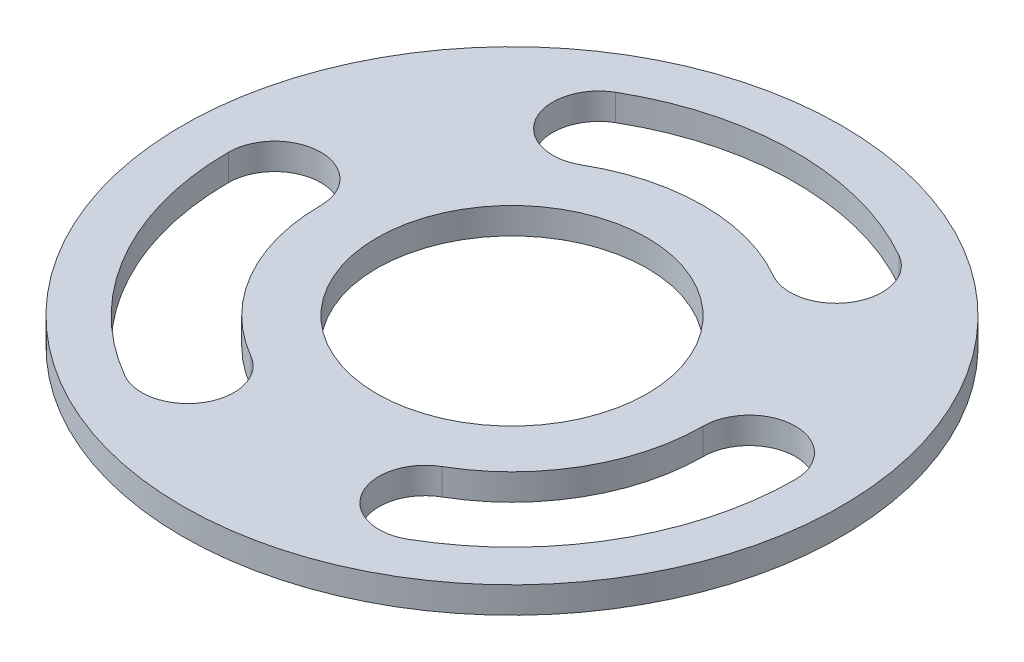
ISO-10303-21;
HEADER;
FILE_DESCRIPTION(('STEP AP214'),'2;1');
FILE_NAME('part.step','',(''),(''),'','','');
FILE_SCHEMA(('AUTOMOTIVE_DESIGN { 1 0 10303 214 1 1 1 1 }'));
ENDSEC;
DATA;
#1=APPLICATION_CONTEXT('core data for automotive mechanical design processes');
#2=APPLICATION_PROTOCOL_DEFINITION('international standard','automotive_design',2000,#1);
#3=PRODUCT_CONTEXT('',#1,'mechanical');
#4=PRODUCT('Part','Part','',(#3));
#5=PRODUCT_RELATED_PRODUCT_CATEGORY('part','',(#4));
#6=PRODUCT_DEFINITION_FORMATION('','',#4);
#7=PRODUCT_DEFINITION_CONTEXT('part definition',#1,'design');
#8=PRODUCT_DEFINITION('design','',#6,#7);
#9=PRODUCT_DEFINITION_SHAPE('','',#8);
#10=(LENGTH_UNIT() NAMED_UNIT(*) SI_UNIT(.MILLI.,.METRE.));
#11=(NAMED_UNIT(*) PLANE_ANGLE_UNIT() SI_UNIT($,.RADIAN.));
#12=(NAMED_UNIT(*) SI_UNIT($,.STERADIAN.) SOLID_ANGLE_UNIT());
#13=UNCERTAINTY_MEASURE_WITH_UNIT(LENGTH_MEASURE(1.E-05),#10,'distance_accuracy_value','');
#14=(GEOMETRIC_REPRESENTATION_CONTEXT(3) GLOBAL_UNCERTAINTY_ASSIGNED_CONTEXT((#13)) GLOBAL_UNIT_ASSIGNED_CONTEXT((#10,
#11,#12)) REPRESENTATION_CONTEXT('',''));
#15=CARTESIAN_POINT('',(0.,0.,0.));
#16=DIRECTION('',(0.,0.,1.));
#17=DIRECTION('',(1.,0.,0.));
#18=AXIS2_PLACEMENT_3D('',#15,#16,#17);
#19=CARTESIAN_POINT('',(0.,1.,0.));
#20=DIRECTION('',(0.,1.,0.));
#21=DIRECTION('',(0.,0.,1.));
#22=AXIS2_PLACEMENT_3D('',#19,#20,#21);
#23=PLANE('',#22);
#24=CARTESIAN_POINT('',(0.,1.,0.));
#25=DIRECTION('',(0.,1.,0.));
#26=DIRECTION('',(0.,0.,1.));
#27=AXIS2_PLACEMENT_3D('',#24,#25,#26);
#28=CIRCLE('',#27,10.7499999999999);
#29=CARTESIAN_POINT('',(5.37500000000003,1.,9.30977309068263));
#30=VERTEX_POINT('',#29);
#31=CARTESIAN_POINT('',(10.7499999999999,1.,-2.48267632254224E-13));
#32=VERTEX_POINT('',#31);
#33=EDGE_CURVE('E159',#30,#32,#28,.T.);
#34=ORIENTED_EDGE('',*,*,#33,.F.);
#35=CARTESIAN_POINT('',(4.49999999999993,1.,7.79422863405971));
#36=DIRECTION('',(0.,1.,0.));
#37=DIRECTION('',(0.,0.,1.));
#38=AXIS2_PLACEMENT_3D('',#35,#36,#37);
#39=CIRCLE('',#38,1.74999999999999);
#40=CARTESIAN_POINT('',(3.62500000000003,1.,6.27868417743714));
#41=VERTEX_POINT('',#40);
#42=EDGE_CURVE('E157',#41,#30,#39,.T.);
#43=ORIENTED_EDGE('',*,*,#42,.F.);
#44=CARTESIAN_POINT('',(0.,1.,0.));
#45=DIRECTION('',(0.,-1.,0.));
#46=DIRECTION('',(0.,0.,1.));
#47=AXIS2_PLACEMENT_3D('',#44,#45,#46);
#48=CIRCLE('',#47,7.24999999999995);
#49=CARTESIAN_POINT('',(7.24999999999995,1.,-1.66927781864533E-13));
#50=VERTEX_POINT('',#49);
#51=EDGE_CURVE('E165',#50,#41,#48,.T.);
#52=ORIENTED_EDGE('',*,*,#51,.F.);
#53=CARTESIAN_POINT('',(8.9999999999999,1.,-2.07018430176111E-13));
#54=DIRECTION('',(0.,1.,0.));
#55=DIRECTION('',(0.,0.,1.));
#56=AXIS2_PLACEMENT_3D('',#53,#54,#55);
#57=CIRCLE('',#56,1.74999999999996);
#58=EDGE_CURVE('E162',#32,#50,#57,.T.);
#59=ORIENTED_EDGE('',*,*,#58,.F.);
#60=EDGE_LOOP('',(#34,#43,#52,#59));
#61=FACE_BOUND('',#60,.T.);
#62=CARTESIAN_POINT('',(0.,1.,0.));
#63=DIRECTION('',(0.,1.,0.));
#64=DIRECTION('',(0.,0.,1.));
#65=AXIS2_PLACEMENT_3D('',#62,#63,#64);
#66=CIRCLE('',#65,5.125);
#67=CARTESIAN_POINT('',(0.,1.,5.125));
#68=VERTEX_POINT('',#67);
#69=EDGE_CURVE('E219',#68,#68,#66,.T.);
#70=ORIENTED_EDGE('',*,*,#69,.F.);
#71=EDGE_LOOP('',(#70));
#72=FACE_BOUND('',#71,.T.);
#73=CARTESIAN_POINT('',(0.,1.,0.));
#74=DIRECTION('',(0.,1.,0.));
#75=DIRECTION('',(0.,0.,1.));
#76=AXIS2_PLACEMENT_3D('',#73,#74,#75);
#77=CIRCLE('',#76,12.5);
#78=CARTESIAN_POINT('',(0.,1.,12.5));
#79=VERTEX_POINT('',#78);
#80=EDGE_CURVE('E11',#79,#79,#77,.T.);
#81=ORIENTED_EDGE('',*,*,#80,.T.);
#82=EDGE_LOOP('',(#81));
#83=FACE_BOUND('',#82,.T.);
#84=CARTESIAN_POINT('',(0.,1.,0.));
#85=DIRECTION('',(0.,1.,0.));
#86=DIRECTION('',(0.,0.,1.));
#87=AXIS2_PLACEMENT_3D('',#84,#85,#86);
#88=CIRCLE('',#87,10.75);
#89=CARTESIAN_POINT('',(5.37499999999975,1.,-9.30977309068281));
#90=VERTEX_POINT('',#89);
#91=CARTESIAN_POINT('',(-5.37499999999992,1.,-9.30977309068272));
#92=VERTEX_POINT('',#91);
#93=EDGE_CURVE('E190',#90,#92,#88,.T.);
#94=ORIENTED_EDGE('',*,*,#93,.F.);
#95=CARTESIAN_POINT('',(4.49999999999988,1.,-7.79422863406019));
#96=DIRECTION('',(0.,1.,0.));
#97=DIRECTION('',(0.,0.,1.));
#98=AXIS2_PLACEMENT_3D('',#95,#96,#97);
#99=CIRCLE('',#98,1.74999999999987);
#100=CARTESIAN_POINT('',(3.62499999999996,1.,-6.27868417743747));
#101=VERTEX_POINT('',#100);
#102=EDGE_CURVE('E188',#101,#90,#99,.T.);
#103=ORIENTED_EDGE('',*,*,#102,.F.);
#104=CARTESIAN_POINT('',(0.,1.,0.));
#105=DIRECTION('',(0.,-1.,0.));
#106=DIRECTION('',(0.,0.,1.));
#107=AXIS2_PLACEMENT_3D('',#104,#105,#106);
#108=CIRCLE('',#107,7.25000000000027);
#109=CARTESIAN_POINT('',(-3.62500000000008,1.,-6.27868417743741));
#110=VERTEX_POINT('',#109);
#111=EDGE_CURVE('E196',#110,#101,#108,.T.);
#112=ORIENTED_EDGE('',*,*,#111,.F.);
#113=CARTESIAN_POINT('',(-4.50000000000008,1.,-7.79422863406019));
#114=DIRECTION('',(0.,1.,0.));
#115=DIRECTION('',(0.,0.,1.));
#116=AXIS2_PLACEMENT_3D('',#113,#114,#115);
#117=CIRCLE('',#116,1.74999999999985);
#118=EDGE_CURVE('E193',#92,#110,#117,.T.);
#119=ORIENTED_EDGE('',*,*,#118,.F.);
#120=EDGE_LOOP('',(#94,#103,#112,#119));
#121=FACE_BOUND('',#120,.T.);
#122=CARTESIAN_POINT('',(0.,1.,0.));
#123=DIRECTION('',(0.,1.,0.));
#124=DIRECTION('',(0.,0.,1.));
#125=AXIS2_PLACEMENT_3D('',#122,#123,#124);
#126=CIRCLE('',#125,10.7499999999998);
#127=CARTESIAN_POINT('',(-10.7499999999998,1.,-2.48513643369444E-13));
#128=VERTEX_POINT('',#127);
#129=CARTESIAN_POINT('',(-5.37500000000015,1.,9.30977309068245));
#130=VERTEX_POINT('',#129);
#131=EDGE_CURVE('E129',#128,#130,#126,.T.);
#132=ORIENTED_EDGE('',*,*,#131,.F.);
#133=CARTESIAN_POINT('',(-9.00000000000009,1.,-2.03531578020356E-13));
#134=DIRECTION('',(0.,1.,0.));
#135=DIRECTION('',(0.,0.,1.));
#136=AXIS2_PLACEMENT_3D('',#133,#134,#135);
#137=CIRCLE('',#136,1.74999999999989);
#138=CARTESIAN_POINT('',(-7.24999999999998,1.,-1.67490556817035E-13));
#139=VERTEX_POINT('',#138);
#140=EDGE_CURVE('E121',#139,#128,#137,.T.);
#141=ORIENTED_EDGE('',*,*,#140,.F.);
#142=CARTESIAN_POINT('',(0.,1.,0.));
#143=DIRECTION('',(0.,-1.,0.));
#144=DIRECTION('',(0.,0.,1.));
#145=AXIS2_PLACEMENT_3D('',#142,#143,#144);
#146=CIRCLE('',#145,7.24999999999998);
#147=CARTESIAN_POINT('',(-3.62500000000015,1.,6.2786841774371));
#148=VERTEX_POINT('',#147);
#149=EDGE_CURVE('E143',#148,#139,#146,.T.);
#150=ORIENTED_EDGE('',*,*,#149,.F.);
#151=CARTESIAN_POINT('',(-4.50000000000011,1.,7.79422863405971));
#152=DIRECTION('',(0.,1.,0.));
#153=DIRECTION('',(0.,0.,1.));
#154=AXIS2_PLACEMENT_3D('',#151,#152,#153);
#155=CIRCLE('',#154,1.74999999999994);
#156=EDGE_CURVE('E141',#130,#148,#155,.T.);
#157=ORIENTED_EDGE('',*,*,#156,.F.);
#158=EDGE_LOOP('',(#132,#141,#150,#157));
#159=FACE_BOUND('',#158,.T.);
#160=ADVANCED_FACE('F32',(#61,#72,#83,#121,#159),#23,.T.);
#161=CARTESIAN_POINT('',(0.,0.,0.));
#162=DIRECTION('',(0.,1.,0.));
#163=DIRECTION('',(0.,0.,1.));
#164=AXIS2_PLACEMENT_3D('',#161,#162,#163);
#165=PLANE('',#164);
#166=CARTESIAN_POINT('',(4.49999999999993,0.,7.79422863405971));
#167=DIRECTION('',(0.,1.,0.));
#168=DIRECTION('',(0.,0.,1.));
#169=AXIS2_PLACEMENT_3D('',#166,#167,#168);
#170=CIRCLE('',#169,1.74999999999999);
#171=CARTESIAN_POINT('',(3.62500000000003,0.,6.27868417743714));
#172=VERTEX_POINT('',#171);
#173=CARTESIAN_POINT('',(5.37500000000003,0.,9.30977309068263));
#174=VERTEX_POINT('',#173);
#175=EDGE_CURVE('E137',#172,#174,#170,.T.);
#176=ORIENTED_EDGE('',*,*,#175,.T.);
#177=CARTESIAN_POINT('',(0.,0.,0.));
#178=DIRECTION('',(0.,1.,0.));
#179=DIRECTION('',(0.,0.,1.));
#180=AXIS2_PLACEMENT_3D('',#177,#178,#179);
#181=CIRCLE('',#180,10.7499999999999);
#182=CARTESIAN_POINT('',(10.7499999999999,0.,-2.48267632254224E-13));
#183=VERTEX_POINT('',#182);
#184=EDGE_CURVE('E170',#174,#183,#181,.T.);
#185=ORIENTED_EDGE('',*,*,#184,.T.);
#186=CARTESIAN_POINT('',(8.9999999999999,0.,-2.07018430176111E-13));
#187=DIRECTION('',(0.,1.,0.));
#188=DIRECTION('',(0.,0.,1.));
#189=AXIS2_PLACEMENT_3D('',#186,#187,#188);
#190=CIRCLE('',#189,1.74999999999996);
#191=CARTESIAN_POINT('',(7.24999999999994,0.,-1.66927781864532E-13));
#192=VERTEX_POINT('',#191);
#193=EDGE_CURVE('E173',#183,#192,#190,.T.);
#194=ORIENTED_EDGE('',*,*,#193,.T.);
#195=CARTESIAN_POINT('',(0.,0.,0.));
#196=DIRECTION('',(0.,-1.,0.));
#197=DIRECTION('',(0.,0.,1.));
#198=AXIS2_PLACEMENT_3D('',#195,#196,#197);
#199=CIRCLE('',#198,7.24999999999995);
#200=EDGE_CURVE('E160',#192,#172,#199,.T.);
#201=ORIENTED_EDGE('',*,*,#200,.T.);
#202=EDGE_LOOP('',(#176,#185,#194,#201));
#203=FACE_BOUND('',#202,.T.);
#204=CARTESIAN_POINT('',(0.,0.,0.));
#205=DIRECTION('',(0.,1.,0.));
#206=DIRECTION('',(0.,0.,1.));
#207=AXIS2_PLACEMENT_3D('',#204,#205,#206);
#208=CIRCLE('',#207,5.125);
#209=CARTESIAN_POINT('',(0.,0.,5.125));
#210=VERTEX_POINT('',#209);
#211=EDGE_CURVE('E218',#210,#210,#208,.T.);
#212=ORIENTED_EDGE('',*,*,#211,.T.);
#213=EDGE_LOOP('',(#212));
#214=FACE_BOUND('',#213,.T.);
#215=CARTESIAN_POINT('',(0.,0.,0.));
#216=DIRECTION('',(0.,1.,0.));
#217=DIRECTION('',(0.,0.,1.));
#218=AXIS2_PLACEMENT_3D('',#215,#216,#217);
#219=CIRCLE('',#218,12.5);
#220=CARTESIAN_POINT('',(0.,0.,12.5));
#221=VERTEX_POINT('',#220);
#222=EDGE_CURVE('E36',#221,#221,#219,.T.);
#223=ORIENTED_EDGE('',*,*,#222,.F.);
#224=EDGE_LOOP('',(#223));
#225=FACE_BOUND('',#224,.T.);
#226=CARTESIAN_POINT('',(4.49999999999988,0.,-7.79422863406019));
#227=DIRECTION('',(0.,1.,0.));
#228=DIRECTION('',(0.,0.,1.));
#229=AXIS2_PLACEMENT_3D('',#226,#227,#228);
#230=CIRCLE('',#229,1.74999999999987);
#231=CARTESIAN_POINT('',(3.62499999999996,0.,-6.27868417743747));
#232=VERTEX_POINT('',#231);
#233=CARTESIAN_POINT('',(5.37499999999975,0.,-9.30977309068281));
#234=VERTEX_POINT('',#233);
#235=EDGE_CURVE('E187',#232,#234,#230,.T.);
#236=ORIENTED_EDGE('',*,*,#235,.T.);
#237=CARTESIAN_POINT('',(0.,0.,0.));
#238=DIRECTION('',(0.,1.,0.));
#239=DIRECTION('',(0.,0.,1.));
#240=AXIS2_PLACEMENT_3D('',#237,#238,#239);
#241=CIRCLE('',#240,10.75);
#242=CARTESIAN_POINT('',(-5.37499999999992,0.,-9.30977309068272));
#243=VERTEX_POINT('',#242);
#244=EDGE_CURVE('E201',#234,#243,#241,.T.);
#245=ORIENTED_EDGE('',*,*,#244,.T.);
#246=CARTESIAN_POINT('',(-4.50000000000008,0.,-7.79422863406019));
#247=DIRECTION('',(0.,1.,0.));
#248=DIRECTION('',(0.,0.,1.));
#249=AXIS2_PLACEMENT_3D('',#246,#247,#248);
#250=CIRCLE('',#249,1.74999999999985);
#251=CARTESIAN_POINT('',(-3.62500000000016,0.,-6.27868417743754));
#252=VERTEX_POINT('',#251);
#253=EDGE_CURVE('E204',#243,#252,#250,.T.);
#254=ORIENTED_EDGE('',*,*,#253,.T.);
#255=CARTESIAN_POINT('',(0.,0.,0.));
#256=DIRECTION('',(0.,-1.,0.));
#257=DIRECTION('',(0.,0.,1.));
#258=AXIS2_PLACEMENT_3D('',#255,#256,#257);
#259=CIRCLE('',#258,7.25000000000027);
#260=EDGE_CURVE('E191',#252,#232,#259,.T.);
#261=ORIENTED_EDGE('',*,*,#260,.T.);
#262=EDGE_LOOP('',(#236,#245,#254,#261));
#263=FACE_BOUND('',#262,.T.);
#264=CARTESIAN_POINT('',(-9.00000000000009,0.,-2.03531578020356E-13));
#265=DIRECTION('',(0.,1.,0.));
#266=DIRECTION('',(0.,0.,1.));
#267=AXIS2_PLACEMENT_3D('',#264,#265,#266);
#268=CIRCLE('',#267,1.74999999999989);
#269=CARTESIAN_POINT('',(-7.24999999999998,0.,-1.67490556817035E-13));
#270=VERTEX_POINT('',#269);
#271=CARTESIAN_POINT('',(-10.7499999999998,0.,-2.48513643369444E-13));
#272=VERTEX_POINT('',#271);
#273=EDGE_CURVE('E55',#270,#272,#268,.T.);
#274=ORIENTED_EDGE('',*,*,#273,.T.);
#275=CARTESIAN_POINT('',(0.,0.,0.));
#276=DIRECTION('',(0.,1.,0.));
#277=DIRECTION('',(0.,0.,1.));
#278=AXIS2_PLACEMENT_3D('',#275,#276,#277);
#279=CIRCLE('',#278,10.7499999999998);
#280=CARTESIAN_POINT('',(-5.37500000000015,0.,9.30977309068245));
#281=VERTEX_POINT('',#280);
#282=EDGE_CURVE('E136',#272,#281,#279,.T.);
#283=ORIENTED_EDGE('',*,*,#282,.T.);
#284=CARTESIAN_POINT('',(-4.50000000000011,0.,7.79422863405971));
#285=DIRECTION('',(0.,1.,0.));
#286=DIRECTION('',(0.,0.,1.));
#287=AXIS2_PLACEMENT_3D('',#284,#285,#286);
#288=CIRCLE('',#287,1.74999999999994);
#289=CARTESIAN_POINT('',(-3.6250000000001,0.,6.27868417743702));
#290=VERTEX_POINT('',#289);
#291=EDGE_CURVE('E149',#281,#290,#288,.T.);
#292=ORIENTED_EDGE('',*,*,#291,.T.);
#293=CARTESIAN_POINT('',(0.,0.,0.));
#294=DIRECTION('',(0.,-1.,0.));
#295=DIRECTION('',(0.,0.,1.));
#296=AXIS2_PLACEMENT_3D('',#293,#294,#295);
#297=CIRCLE('',#296,7.24999999999998);
#298=EDGE_CURVE('E130',#290,#270,#297,.T.);
#299=ORIENTED_EDGE('',*,*,#298,.T.);
#300=EDGE_LOOP('',(#274,#283,#292,#299));
#301=FACE_BOUND('',#300,.T.);
#302=ADVANCED_FACE('F225',(#203,#214,#225,#263,#301),#165,.F.);
#303=CARTESIAN_POINT('',(0.,1.,0.));
#304=DIRECTION('',(0.,-1.,0.));
#305=DIRECTION('',(0.,0.,-1.));
#306=AXIS2_PLACEMENT_3D('',#303,#304,#305);
#307=CYLINDRICAL_SURFACE('',#306,12.5);
#308=ORIENTED_EDGE('',*,*,#80,.F.);
#309=EDGE_LOOP('',(#308));
#310=FACE_BOUND('',#309,.T.);
#311=ORIENTED_EDGE('',*,*,#222,.T.);
#312=EDGE_LOOP('',(#311));
#313=FACE_BOUND('',#312,.T.);
#314=ADVANCED_FACE('F34',(#310,#313),#307,.T.);
#315=CARTESIAN_POINT('',(0.,1.,0.));
#316=DIRECTION('',(0.,-1.,0.));
#317=DIRECTION('',(0.,0.,-1.));
#318=AXIS2_PLACEMENT_3D('',#315,#316,#317);
#319=CYLINDRICAL_SURFACE('',#318,5.125);
#320=ORIENTED_EDGE('',*,*,#69,.T.);
#321=EDGE_LOOP('',(#320));
#322=FACE_BOUND('',#321,.T.);
#323=ORIENTED_EDGE('',*,*,#211,.F.);
#324=EDGE_LOOP('',(#323));
#325=FACE_BOUND('',#324,.T.);
#326=ADVANCED_FACE('F228',(#322,#325),#319,.F.);
#327=CARTESIAN_POINT('',(4.49999999999988,1.,-7.79422863406019));
#328=DIRECTION('',(0.,-1.,0.));
#329=DIRECTION('',(0.,0.,-1.));
#330=AXIS2_PLACEMENT_3D('',#327,#328,#329);
#331=CYLINDRICAL_SURFACE('',#330,1.74999999999987);
#332=ORIENTED_EDGE('',*,*,#235,.F.);
#333=DIRECTION('',(0.,-1.,0.));
#334=VECTOR('',#333,1.);
#335=CARTESIAN_POINT('',(3.62499999999996,1.,-6.27868417743747));
#336=LINE('',#335,#334);
#337=EDGE_CURVE('E198',#101,#232,#336,.T.);
#338=ORIENTED_EDGE('',*,*,#337,.F.);
#339=ORIENTED_EDGE('',*,*,#102,.T.);
#340=DIRECTION('',(0.,-1.,0.));
#341=VECTOR('',#340,1.);
#342=CARTESIAN_POINT('',(5.37499999999975,1.,-9.30977309068281));
#343=LINE('',#342,#341);
#344=EDGE_CURVE('E215',#90,#234,#343,.T.);
#345=ORIENTED_EDGE('',*,*,#344,.T.);
#346=EDGE_LOOP('',(#332,#338,#339,#345));
#347=FACE_BOUND('',#346,.T.);
#348=ADVANCED_FACE('F230',(#347),#331,.F.);
#349=CARTESIAN_POINT('',(0.,1.,0.));
#350=DIRECTION('',(0.,-1.,0.));
#351=DIRECTION('',(0.,0.,-1.));
#352=AXIS2_PLACEMENT_3D('',#349,#350,#351);
#353=CYLINDRICAL_SURFACE('',#352,10.75);
#354=ORIENTED_EDGE('',*,*,#244,.F.);
#355=ORIENTED_EDGE('',*,*,#344,.F.);
#356=ORIENTED_EDGE('',*,*,#93,.T.);
#357=DIRECTION('',(0.,-1.,0.));
#358=VECTOR('',#357,1.);
#359=CARTESIAN_POINT('',(-5.37499999999992,1.,-9.30977309068272));
#360=LINE('',#359,#358);
#361=EDGE_CURVE('E213',#92,#243,#360,.T.);
#362=ORIENTED_EDGE('',*,*,#361,.T.);
#363=EDGE_LOOP('',(#354,#355,#356,#362));
#364=FACE_BOUND('',#363,.T.);
#365=ADVANCED_FACE('F237',(#364),#353,.F.);
#366=CARTESIAN_POINT('',(-4.50000000000008,1.,-7.79422863406019));
#367=DIRECTION('',(0.,-1.,0.));
#368=DIRECTION('',(0.,0.,-1.));
#369=AXIS2_PLACEMENT_3D('',#366,#367,#368);
#370=CYLINDRICAL_SURFACE('',#369,1.74999999999985);
#371=ORIENTED_EDGE('',*,*,#253,.F.);
#372=ORIENTED_EDGE('',*,*,#361,.F.);
#373=ORIENTED_EDGE('',*,*,#118,.T.);
#374=DIRECTION('',(0.,-1.,0.));
#375=VECTOR('',#374,1.);
#376=CARTESIAN_POINT('',(-3.62500000000016,1.,-6.27868417743754));
#377=LINE('',#376,#375);
#378=EDGE_CURVE('E211',#110,#252,#377,.T.);
#379=ORIENTED_EDGE('',*,*,#378,.T.);
#380=EDGE_LOOP('',(#371,#372,#373,#379));
#381=FACE_BOUND('',#380,.T.);
#382=ADVANCED_FACE('F265',(#381),#370,.F.);
#383=CARTESIAN_POINT('',(0.,1.,0.));
#384=DIRECTION('',(0.,-1.,0.));
#385=DIRECTION('',(0.,0.,-1.));
#386=AXIS2_PLACEMENT_3D('',#383,#384,#385);
#387=CYLINDRICAL_SURFACE('',#386,7.25000000000027);
#388=ORIENTED_EDGE('',*,*,#260,.F.);
#389=ORIENTED_EDGE('',*,*,#378,.F.);
#390=ORIENTED_EDGE('',*,*,#111,.T.);
#391=ORIENTED_EDGE('',*,*,#337,.T.);
#392=EDGE_LOOP('',(#388,#389,#390,#391));
#393=FACE_BOUND('',#392,.T.);
#394=ADVANCED_FACE('F271',(#393),#387,.T.);
#395=CARTESIAN_POINT('',(4.49999999999993,1.,7.79422863405971));
#396=DIRECTION('',(0.,-1.,0.));
#397=DIRECTION('',(0.,0.,-1.));
#398=AXIS2_PLACEMENT_3D('',#395,#396,#397);
#399=CYLINDRICAL_SURFACE('',#398,1.74999999999999);
#400=ORIENTED_EDGE('',*,*,#175,.F.);
#401=DIRECTION('',(0.,-1.,0.));
#402=VECTOR('',#401,1.);
#403=CARTESIAN_POINT('',(3.62500000000003,1.,6.27868417743714));
#404=LINE('',#403,#402);
#405=EDGE_CURVE('E167',#41,#172,#404,.T.);
#406=ORIENTED_EDGE('',*,*,#405,.F.);
#407=ORIENTED_EDGE('',*,*,#42,.T.);
#408=DIRECTION('',(0.,-1.,0.));
#409=VECTOR('',#408,1.);
#410=CARTESIAN_POINT('',(5.37500000000003,1.,9.30977309068263));
#411=LINE('',#410,#409);
#412=EDGE_CURVE('E184',#30,#174,#411,.T.);
#413=ORIENTED_EDGE('',*,*,#412,.T.);
#414=EDGE_LOOP('',(#400,#406,#407,#413));
#415=FACE_BOUND('',#414,.T.);
#416=ADVANCED_FACE('F273',(#415),#399,.F.);
#417=CARTESIAN_POINT('',(0.,1.,0.));
#418=DIRECTION('',(0.,-1.,0.));
#419=DIRECTION('',(0.,0.,-1.));
#420=AXIS2_PLACEMENT_3D('',#417,#418,#419);
#421=CYLINDRICAL_SURFACE('',#420,10.7499999999999);
#422=ORIENTED_EDGE('',*,*,#184,.F.);
#423=ORIENTED_EDGE('',*,*,#412,.F.);
#424=ORIENTED_EDGE('',*,*,#33,.T.);
#425=DIRECTION('',(0.,-1.,0.));
#426=VECTOR('',#425,1.);
#427=CARTESIAN_POINT('',(10.7499999999999,1.,-2.48267632254224E-13));
#428=LINE('',#427,#426);
#429=EDGE_CURVE('E182',#32,#183,#428,.T.);
#430=ORIENTED_EDGE('',*,*,#429,.T.);
#431=EDGE_LOOP('',(#422,#423,#424,#430));
#432=FACE_BOUND('',#431,.T.);
#433=ADVANCED_FACE('F279',(#432),#421,.F.);
#434=CARTESIAN_POINT('',(8.9999999999999,1.,-2.07018430176111E-13));
#435=DIRECTION('',(0.,-1.,0.));
#436=DIRECTION('',(0.,0.,-1.));
#437=AXIS2_PLACEMENT_3D('',#434,#435,#436);
#438=CYLINDRICAL_SURFACE('',#437,1.74999999999996);
#439=ORIENTED_EDGE('',*,*,#193,.F.);
#440=ORIENTED_EDGE('',*,*,#429,.F.);
#441=ORIENTED_EDGE('',*,*,#58,.T.);
#442=DIRECTION('',(0.,-1.,0.));
#443=VECTOR('',#442,1.);
#444=CARTESIAN_POINT('',(7.24999999999994,1.,-1.66927781864532E-13));
#445=LINE('',#444,#443);
#446=EDGE_CURVE('E180',#50,#192,#445,.T.);
#447=ORIENTED_EDGE('',*,*,#446,.T.);
#448=EDGE_LOOP('',(#439,#440,#441,#447));
#449=FACE_BOUND('',#448,.T.);
#450=ADVANCED_FACE('F313',(#449),#438,.F.);
#451=CARTESIAN_POINT('',(0.,1.,0.));
#452=DIRECTION('',(0.,-1.,0.));
#453=DIRECTION('',(0.,0.,-1.));
#454=AXIS2_PLACEMENT_3D('',#451,#452,#453);
#455=CYLINDRICAL_SURFACE('',#454,7.24999999999995);
#456=ORIENTED_EDGE('',*,*,#200,.F.);
#457=ORIENTED_EDGE('',*,*,#446,.F.);
#458=ORIENTED_EDGE('',*,*,#51,.T.);
#459=ORIENTED_EDGE('',*,*,#405,.T.);
#460=EDGE_LOOP('',(#456,#457,#458,#459));
#461=FACE_BOUND('',#460,.T.);
#462=ADVANCED_FACE('F322',(#461),#455,.T.);
#463=CARTESIAN_POINT('',(-9.00000000000009,1.,-2.03531578020356E-13));
#464=DIRECTION('',(0.,-1.,0.));
#465=DIRECTION('',(0.,0.,-1.));
#466=AXIS2_PLACEMENT_3D('',#463,#464,#465);
#467=CYLINDRICAL_SURFACE('',#466,1.74999999999989);
#468=ORIENTED_EDGE('',*,*,#273,.F.);
#469=DIRECTION('',(0.,-1.,0.));
#470=VECTOR('',#469,1.);
#471=CARTESIAN_POINT('',(-7.24999999999998,1.,-1.67490556817035E-13));
#472=LINE('',#471,#470);
#473=EDGE_CURVE('E125',#139,#270,#472,.T.);
#474=ORIENTED_EDGE('',*,*,#473,.F.);
#475=ORIENTED_EDGE('',*,*,#140,.T.);
#476=DIRECTION('',(0.,-1.,0.));
#477=VECTOR('',#476,1.);
#478=CARTESIAN_POINT('',(-10.7499999999998,1.,-2.48513643369444E-13));
#479=LINE('',#478,#477);
#480=EDGE_CURVE('E124',#128,#272,#479,.T.);
#481=ORIENTED_EDGE('',*,*,#480,.T.);
#482=EDGE_LOOP('',(#468,#474,#475,#481));
#483=FACE_BOUND('',#482,.T.);
#484=ADVANCED_FACE('F123',(#483),#467,.F.);
#485=CARTESIAN_POINT('',(0.,1.,0.));
#486=DIRECTION('',(0.,-1.,0.));
#487=DIRECTION('',(0.,0.,-1.));
#488=AXIS2_PLACEMENT_3D('',#485,#486,#487);
#489=CYLINDRICAL_SURFACE('',#488,10.7499999999998);
#490=ORIENTED_EDGE('',*,*,#282,.F.);
#491=ORIENTED_EDGE('',*,*,#480,.F.);
#492=ORIENTED_EDGE('',*,*,#131,.T.);
#493=DIRECTION('',(0.,-1.,0.));
#494=VECTOR('',#493,1.);
#495=CARTESIAN_POINT('',(-5.37500000000015,1.,9.30977309068245));
#496=LINE('',#495,#494);
#497=EDGE_CURVE('E138',#130,#281,#496,.T.);
#498=ORIENTED_EDGE('',*,*,#497,.T.);
#499=EDGE_LOOP('',(#490,#491,#492,#498));
#500=FACE_BOUND('',#499,.T.);
#501=ADVANCED_FACE('F133',(#500),#489,.F.);
#502=CARTESIAN_POINT('',(-4.50000000000011,1.,7.79422863405971));
#503=DIRECTION('',(0.,-1.,0.));
#504=DIRECTION('',(0.,0.,-1.));
#505=AXIS2_PLACEMENT_3D('',#502,#503,#504);
#506=CYLINDRICAL_SURFACE('',#505,1.74999999999994);
#507=ORIENTED_EDGE('',*,*,#291,.F.);
#508=ORIENTED_EDGE('',*,*,#497,.F.);
#509=ORIENTED_EDGE('',*,*,#156,.T.);
#510=DIRECTION('',(0.,-1.,0.));
#511=VECTOR('',#510,1.);
#512=CARTESIAN_POINT('',(-3.6250000000001,1.,6.27868417743702));
#513=LINE('',#512,#511);
#514=EDGE_CURVE('E47',#148,#290,#513,.T.);
#515=ORIENTED_EDGE('',*,*,#514,.T.);
#516=EDGE_LOOP('',(#507,#508,#509,#515));
#517=FACE_BOUND('',#516,.T.);
#518=ADVANCED_FACE('F349',(#517),#506,.F.);
#519=CARTESIAN_POINT('',(0.,1.,0.));
#520=DIRECTION('',(0.,-1.,0.));
#521=DIRECTION('',(0.,0.,-1.));
#522=AXIS2_PLACEMENT_3D('',#519,#520,#521);
#523=CYLINDRICAL_SURFACE('',#522,7.24999999999998);
#524=ORIENTED_EDGE('',*,*,#298,.F.);
#525=ORIENTED_EDGE('',*,*,#514,.F.);
#526=ORIENTED_EDGE('',*,*,#149,.T.);
#527=ORIENTED_EDGE('',*,*,#473,.T.);
#528=EDGE_LOOP('',(#524,#525,#526,#527));
#529=FACE_BOUND('',#528,.T.);
#530=ADVANCED_FACE('F358',(#529),#523,.T.);
#531=CLOSED_SHELL('',(#160,#302,#314,#326,#348,#365,#382,#394,#416,#433,#450,#462,#484,#501,
#518,#530));
#532=MANIFOLD_SOLID_BREP('B2',#531);
#533=ADVANCED_BREP_SHAPE_REPRESENTATION('',(#18,#532),#14);
#534=SHAPE_DEFINITION_REPRESENTATION(#9,#533);
ENDSEC;
END-ISO-10303-21;
